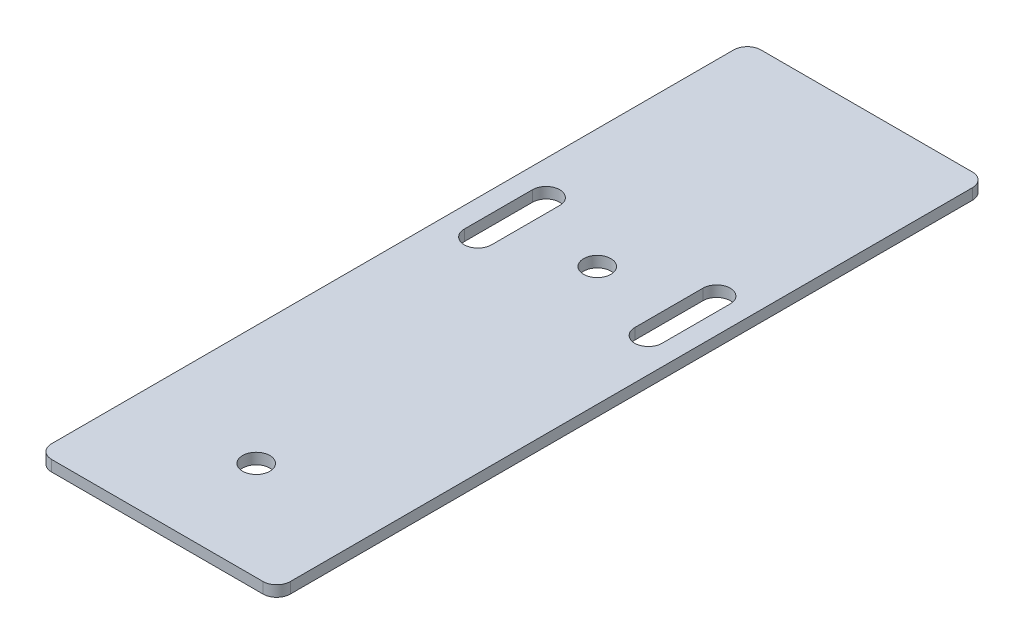
ISO-10303-21;
HEADER;
FILE_DESCRIPTION(('STEP AP214'),'2;1');
FILE_NAME('part.step','',(''),(''),'','','');
FILE_SCHEMA(('AUTOMOTIVE_DESIGN { 1 0 10303 214 1 1 1 1 }'));
ENDSEC;
DATA;
#1=APPLICATION_CONTEXT('core data for automotive mechanical design processes');
#2=APPLICATION_PROTOCOL_DEFINITION('international standard','automotive_design',2000,#1);
#3=PRODUCT_CONTEXT('',#1,'mechanical');
#4=PRODUCT('Part','Part','',(#3));
#5=PRODUCT_RELATED_PRODUCT_CATEGORY('part','',(#4));
#6=PRODUCT_DEFINITION_FORMATION('','',#4);
#7=PRODUCT_DEFINITION_CONTEXT('part definition',#1,'design');
#8=PRODUCT_DEFINITION('design','',#6,#7);
#9=PRODUCT_DEFINITION_SHAPE('','',#8);
#10=(LENGTH_UNIT() NAMED_UNIT(*) SI_UNIT(.MILLI.,.METRE.));
#11=(NAMED_UNIT(*) PLANE_ANGLE_UNIT() SI_UNIT($,.RADIAN.));
#12=(NAMED_UNIT(*) SI_UNIT($,.STERADIAN.) SOLID_ANGLE_UNIT());
#13=UNCERTAINTY_MEASURE_WITH_UNIT(LENGTH_MEASURE(1.E-05),#10,'distance_accuracy_value','');
#14=(GEOMETRIC_REPRESENTATION_CONTEXT(3) GLOBAL_UNCERTAINTY_ASSIGNED_CONTEXT((#13)) GLOBAL_UNIT_ASSIGNED_CONTEXT((#10,
#11,#12)) REPRESENTATION_CONTEXT('',''));
#15=CARTESIAN_POINT('',(0.,0.,0.));
#16=DIRECTION('',(0.,0.,1.));
#17=DIRECTION('',(1.,0.,0.));
#18=AXIS2_PLACEMENT_3D('',#15,#16,#17);
#19=CARTESIAN_POINT('',(17.5,1.6,-52.));
#20=DIRECTION('',(-1.,0.,0.));
#21=DIRECTION('',(0.,0.,1.));
#22=AXIS2_PLACEMENT_3D('',#19,#20,#21);
#23=PLANE('',#22);
#24=DIRECTION('',(0.,0.,-1.));
#25=VECTOR('',#24,1.);
#26=CARTESIAN_POINT('',(17.5,0.,-52.));
#27=LINE('',#26,#25);
#28=CARTESIAN_POINT('',(17.5,0.,50.));
#29=VERTEX_POINT('',#28);
#30=CARTESIAN_POINT('',(17.5,0.,-50.));
#31=VERTEX_POINT('',#30);
#32=EDGE_CURVE('E256',#29,#31,#27,.T.);
#33=ORIENTED_EDGE('',*,*,#32,.T.);
#34=DIRECTION('',(0.,-1.,0.));
#35=VECTOR('',#34,1.);
#36=CARTESIAN_POINT('',(17.5,1.6,-50.));
#37=LINE('',#36,#35);
#38=CARTESIAN_POINT('',(17.5,1.6,-50.));
#39=VERTEX_POINT('',#38);
#40=EDGE_CURVE('E337',#31,#39,#37,.F.);
#41=ORIENTED_EDGE('',*,*,#40,.T.);
#42=DIRECTION('',(0.,0.,-1.));
#43=VECTOR('',#42,1.);
#44=CARTESIAN_POINT('',(17.5,1.6,-52.));
#45=LINE('',#44,#43);
#46=CARTESIAN_POINT('',(17.5,1.6,50.));
#47=VERTEX_POINT('',#46);
#48=EDGE_CURVE('E268',#47,#39,#45,.T.);
#49=ORIENTED_EDGE('',*,*,#48,.F.);
#50=DIRECTION('',(0.,-1.,0.));
#51=VECTOR('',#50,1.);
#52=CARTESIAN_POINT('',(17.5,1.6,50.));
#53=LINE('',#52,#51);
#54=EDGE_CURVE('E333',#47,#29,#53,.T.);
#55=ORIENTED_EDGE('',*,*,#54,.T.);
#56=EDGE_LOOP('',(#33,#41,#49,#55));
#57=FACE_BOUND('',#56,.T.);
#58=ADVANCED_FACE('F38',(#57),#23,.F.);
#59=CARTESIAN_POINT('',(-17.5,1.6,-52.));
#60=DIRECTION('',(0.,0.,1.));
#61=DIRECTION('',(1.,0.,0.));
#62=AXIS2_PLACEMENT_3D('',#59,#60,#61);
#63=PLANE('',#62);
#64=DIRECTION('',(-1.,0.,0.));
#65=VECTOR('',#64,1.);
#66=CARTESIAN_POINT('',(-17.5,0.,-52.));
#67=LINE('',#66,#65);
#68=CARTESIAN_POINT('',(15.5,0.,-52.));
#69=VERTEX_POINT('',#68);
#70=CARTESIAN_POINT('',(-15.5,0.,-52.));
#71=VERTEX_POINT('',#70);
#72=EDGE_CURVE('E287',#69,#71,#67,.T.);
#73=ORIENTED_EDGE('',*,*,#72,.T.);
#74=DIRECTION('',(0.,-1.,0.));
#75=VECTOR('',#74,1.);
#76=CARTESIAN_POINT('',(-15.5,1.6,-52.));
#77=LINE('',#76,#75);
#78=CARTESIAN_POINT('',(-15.5,1.6,-52.));
#79=VERTEX_POINT('',#78);
#80=EDGE_CURVE('E319',#71,#79,#77,.F.);
#81=ORIENTED_EDGE('',*,*,#80,.T.);
#82=DIRECTION('',(-1.,0.,0.));
#83=VECTOR('',#82,1.);
#84=CARTESIAN_POINT('',(-17.5,1.6,-52.));
#85=LINE('',#84,#83);
#86=CARTESIAN_POINT('',(15.5,1.6,-52.));
#87=VERTEX_POINT('',#86);
#88=EDGE_CURVE('E272',#87,#79,#85,.T.);
#89=ORIENTED_EDGE('',*,*,#88,.F.);
#90=DIRECTION('',(0.,-1.,0.));
#91=VECTOR('',#90,1.);
#92=CARTESIAN_POINT('',(15.5,1.6,-52.));
#93=LINE('',#92,#91);
#94=EDGE_CURVE('E315',#87,#69,#93,.T.);
#95=ORIENTED_EDGE('',*,*,#94,.T.);
#96=EDGE_LOOP('',(#73,#81,#89,#95));
#97=FACE_BOUND('',#96,.T.);
#98=ADVANCED_FACE('F363',(#97),#63,.F.);
#99=CARTESIAN_POINT('',(-17.5,1.6,-52.));
#100=DIRECTION('',(1.,0.,0.));
#101=DIRECTION('',(0.,0.,-1.));
#102=AXIS2_PLACEMENT_3D('',#99,#100,#101);
#103=PLANE('',#102);
#104=DIRECTION('',(0.,0.,1.));
#105=VECTOR('',#104,1.);
#106=CARTESIAN_POINT('',(-17.5,1.6,-52.));
#107=LINE('',#106,#105);
#108=CARTESIAN_POINT('',(-17.5,1.6,-50.));
#109=VERTEX_POINT('',#108);
#110=CARTESIAN_POINT('',(-17.5,1.6,50.));
#111=VERTEX_POINT('',#110);
#112=EDGE_CURVE('E277',#109,#111,#107,.T.);
#113=ORIENTED_EDGE('',*,*,#112,.F.);
#114=DIRECTION('',(0.,-1.,0.));
#115=VECTOR('',#114,1.);
#116=CARTESIAN_POINT('',(-17.5,1.6,-50.));
#117=LINE('',#116,#115);
#118=CARTESIAN_POINT('',(-17.5,0.,-50.));
#119=VERTEX_POINT('',#118);
#120=EDGE_CURVE('E299',#109,#119,#117,.T.);
#121=ORIENTED_EDGE('',*,*,#120,.T.);
#122=DIRECTION('',(0.,0.,1.));
#123=VECTOR('',#122,1.);
#124=CARTESIAN_POINT('',(-17.5,0.,-52.));
#125=LINE('',#124,#123);
#126=CARTESIAN_POINT('',(-17.5,0.,50.));
#127=VERTEX_POINT('',#126);
#128=EDGE_CURVE('E291',#119,#127,#125,.T.);
#129=ORIENTED_EDGE('',*,*,#128,.T.);
#130=DIRECTION('',(0.,-1.,0.));
#131=VECTOR('',#130,1.);
#132=CARTESIAN_POINT('',(-17.5,1.6,50.));
#133=LINE('',#132,#131);
#134=EDGE_CURVE('E283',#127,#111,#133,.F.);
#135=ORIENTED_EDGE('',*,*,#134,.T.);
#136=EDGE_LOOP('',(#113,#121,#129,#135));
#137=FACE_BOUND('',#136,.T.);
#138=ADVANCED_FACE('F371',(#137),#103,.F.);
#139=CARTESIAN_POINT('',(-17.5,1.6,52.));
#140=DIRECTION('',(0.,0.,-1.));
#141=DIRECTION('',(-1.,0.,0.));
#142=AXIS2_PLACEMENT_3D('',#139,#140,#141);
#143=PLANE('',#142);
#144=DIRECTION('',(1.,0.,0.));
#145=VECTOR('',#144,1.);
#146=CARTESIAN_POINT('',(-17.5,0.,52.));
#147=LINE('',#146,#145);
#148=CARTESIAN_POINT('',(-15.5,0.,52.));
#149=VERTEX_POINT('',#148);
#150=CARTESIAN_POINT('',(15.5,0.,52.));
#151=VERTEX_POINT('',#150);
#152=EDGE_CURVE('E273',#149,#151,#147,.T.);
#153=ORIENTED_EDGE('',*,*,#152,.T.);
#154=DIRECTION('',(0.,-1.,0.));
#155=VECTOR('',#154,1.);
#156=CARTESIAN_POINT('',(15.5,1.6,52.));
#157=LINE('',#156,#155);
#158=CARTESIAN_POINT('',(15.5,1.6,52.));
#159=VERTEX_POINT('',#158);
#160=EDGE_CURVE('E11',#151,#159,#157,.F.);
#161=ORIENTED_EDGE('',*,*,#160,.T.);
#162=DIRECTION('',(1.,0.,0.));
#163=VECTOR('',#162,1.);
#164=CARTESIAN_POINT('',(-17.5,1.6,52.));
#165=LINE('',#164,#163);
#166=CARTESIAN_POINT('',(-15.5,1.6,52.));
#167=VERTEX_POINT('',#166);
#168=EDGE_CURVE('E280',#167,#159,#165,.T.);
#169=ORIENTED_EDGE('',*,*,#168,.F.);
#170=DIRECTION('',(0.,-1.,0.));
#171=VECTOR('',#170,1.);
#172=CARTESIAN_POINT('',(-15.5,1.6,52.));
#173=LINE('',#172,#171);
#174=EDGE_CURVE('E47',#167,#149,#173,.T.);
#175=ORIENTED_EDGE('',*,*,#174,.T.);
#176=EDGE_LOOP('',(#153,#161,#169,#175));
#177=FACE_BOUND('',#176,.T.);
#178=ADVANCED_FACE('F343',(#177),#143,.F.);
#179=CARTESIAN_POINT('',(0.,1.6,0.));
#180=DIRECTION('',(0.,1.,0.));
#181=DIRECTION('',(0.,0.,1.));
#182=AXIS2_PLACEMENT_3D('',#179,#180,#181);
#183=PLANE('',#182);
#184=CARTESIAN_POINT('',(12.5,1.6,-7.49999999999995));
#185=DIRECTION('',(0.,1.,0.));
#186=DIRECTION('',(0.,0.,1.));
#187=AXIS2_PLACEMENT_3D('',#184,#185,#186);
#188=CIRCLE('',#187,2.);
#189=CARTESIAN_POINT('',(10.5,1.6,-7.49999999999995));
#190=VERTEX_POINT('',#189);
#191=CARTESIAN_POINT('',(14.5,1.6,-7.49999999999995));
#192=VERTEX_POINT('',#191);
#193=EDGE_CURVE('E159',#190,#192,#188,.T.);
#194=ORIENTED_EDGE('',*,*,#193,.F.);
#195=DIRECTION('',(0.,0.,1.));
#196=VECTOR('',#195,1.);
#197=CARTESIAN_POINT('',(10.5,1.6,-7.49999999999995));
#198=LINE('',#197,#196);
#199=CARTESIAN_POINT('',(10.5,1.6,-17.5));
#200=VERTEX_POINT('',#199);
#201=EDGE_CURVE('E180',#200,#190,#198,.T.);
#202=ORIENTED_EDGE('',*,*,#201,.F.);
#203=CARTESIAN_POINT('',(12.5,1.6,-17.5));
#204=DIRECTION('',(0.,1.,0.));
#205=DIRECTION('',(0.,0.,1.));
#206=AXIS2_PLACEMENT_3D('',#203,#204,#205);
#207=CIRCLE('',#206,2.);
#208=CARTESIAN_POINT('',(14.5,1.6,-17.5));
#209=VERTEX_POINT('',#208);
#210=EDGE_CURVE('E184',#209,#200,#207,.T.);
#211=ORIENTED_EDGE('',*,*,#210,.F.);
#212=DIRECTION('',(0.,0.,-1.));
#213=VECTOR('',#212,1.);
#214=CARTESIAN_POINT('',(14.5,1.6,-7.49999999999995));
#215=LINE('',#214,#213);
#216=EDGE_CURVE('E193',#192,#209,#215,.T.);
#217=ORIENTED_EDGE('',*,*,#216,.F.);
#218=EDGE_LOOP('',(#194,#202,#211,#217));
#219=FACE_BOUND('',#218,.T.);
#220=CARTESIAN_POINT('',(-12.5,1.6,-7.49999999999995));
#221=DIRECTION('',(0.,1.,0.));
#222=DIRECTION('',(0.,0.,-1.));
#223=AXIS2_PLACEMENT_3D('',#220,#221,#222);
#224=CIRCLE('',#223,2.);
#225=CARTESIAN_POINT('',(-14.5,1.6,-7.49999999999995));
#226=VERTEX_POINT('',#225);
#227=CARTESIAN_POINT('',(-10.5,1.6,-7.49999999999995));
#228=VERTEX_POINT('',#227);
#229=EDGE_CURVE('E227',#226,#228,#224,.T.);
#230=ORIENTED_EDGE('',*,*,#229,.F.);
#231=DIRECTION('',(0.,0.,1.));
#232=VECTOR('',#231,1.);
#233=CARTESIAN_POINT('',(-14.5,1.6,-7.49999999999995));
#234=LINE('',#233,#232);
#235=CARTESIAN_POINT('',(-14.5,1.6,-17.5));
#236=VERTEX_POINT('',#235);
#237=EDGE_CURVE('E214',#236,#226,#234,.T.);
#238=ORIENTED_EDGE('',*,*,#237,.F.);
#239=CARTESIAN_POINT('',(-12.5,1.6,-17.5));
#240=DIRECTION('',(0.,1.,0.));
#241=DIRECTION('',(0.,0.,-1.));
#242=AXIS2_PLACEMENT_3D('',#239,#240,#241);
#243=CIRCLE('',#242,2.);
#244=CARTESIAN_POINT('',(-10.5,1.6,-17.5));
#245=VERTEX_POINT('',#244);
#246=EDGE_CURVE('E234',#245,#236,#243,.T.);
#247=ORIENTED_EDGE('',*,*,#246,.F.);
#248=DIRECTION('',(0.,0.,-1.));
#249=VECTOR('',#248,1.);
#250=CARTESIAN_POINT('',(-10.5,1.6,-7.49999999999995));
#251=LINE('',#250,#249);
#252=EDGE_CURVE('E230',#228,#245,#251,.T.);
#253=ORIENTED_EDGE('',*,*,#252,.F.);
#254=EDGE_LOOP('',(#230,#238,#247,#253));
#255=FACE_BOUND('',#254,.T.);
#256=CARTESIAN_POINT('',(0.,1.6,-12.5));
#257=DIRECTION('',(0.,1.,0.));
#258=DIRECTION('',(0.,0.,1.));
#259=AXIS2_PLACEMENT_3D('',#256,#257,#258);
#260=CIRCLE('',#259,1.99999999999999);
#261=CARTESIAN_POINT('',(0.,1.6,-10.5));
#262=VERTEX_POINT('',#261);
#263=EDGE_CURVE('E257',#262,#262,#260,.T.);
#264=ORIENTED_EDGE('',*,*,#263,.F.);
#265=EDGE_LOOP('',(#264));
#266=FACE_BOUND('',#265,.T.);
#267=CARTESIAN_POINT('',(0.,1.6,37.5));
#268=DIRECTION('',(0.,1.,0.));
#269=DIRECTION('',(0.,0.,1.));
#270=AXIS2_PLACEMENT_3D('',#267,#268,#269);
#271=CIRCLE('',#270,2.00000000000001);
#272=CARTESIAN_POINT('',(0.,1.6,39.5));
#273=VERTEX_POINT('',#272);
#274=EDGE_CURVE('E203',#273,#273,#271,.T.);
#275=ORIENTED_EDGE('',*,*,#274,.F.);
#276=EDGE_LOOP('',(#275));
#277=FACE_BOUND('',#276,.T.);
#278=ORIENTED_EDGE('',*,*,#88,.T.);
#279=CARTESIAN_POINT('',(-15.5,1.6,-50.));
#280=DIRECTION('',(0.,1.,0.));
#281=DIRECTION('',(0.,0.,1.));
#282=AXIS2_PLACEMENT_3D('',#279,#280,#281);
#283=CIRCLE('',#282,2.);
#284=EDGE_CURVE('E330',#79,#109,#283,.T.);
#285=ORIENTED_EDGE('',*,*,#284,.T.);
#286=ORIENTED_EDGE('',*,*,#112,.T.);
#287=CARTESIAN_POINT('',(-15.5,1.6,50.));
#288=DIRECTION('',(0.,1.,0.));
#289=DIRECTION('',(0.,0.,1.));
#290=AXIS2_PLACEMENT_3D('',#287,#288,#289);
#291=CIRCLE('',#290,2.);
#292=EDGE_CURVE('E59',#111,#167,#291,.T.);
#293=ORIENTED_EDGE('',*,*,#292,.T.);
#294=ORIENTED_EDGE('',*,*,#168,.T.);
#295=CARTESIAN_POINT('',(15.5,1.6,50.));
#296=DIRECTION('',(0.,1.,0.));
#297=DIRECTION('',(0.,0.,1.));
#298=AXIS2_PLACEMENT_3D('',#295,#296,#297);
#299=CIRCLE('',#298,2.);
#300=EDGE_CURVE('E324',#159,#47,#299,.T.);
#301=ORIENTED_EDGE('',*,*,#300,.T.);
#302=ORIENTED_EDGE('',*,*,#48,.T.);
#303=CARTESIAN_POINT('',(15.5,1.6,-50.));
#304=DIRECTION('',(0.,1.,0.));
#305=DIRECTION('',(0.,0.,1.));
#306=AXIS2_PLACEMENT_3D('',#303,#304,#305);
#307=CIRCLE('',#306,2.);
#308=EDGE_CURVE('E327',#39,#87,#307,.T.);
#309=ORIENTED_EDGE('',*,*,#308,.T.);
#310=EDGE_LOOP('',(#278,#285,#286,#293,#294,#301,#302,#309));
#311=FACE_BOUND('',#310,.T.);
#312=ADVANCED_FACE('F356',(#219,#255,#266,#277,#311),#183,.T.);
#313=CARTESIAN_POINT('',(0.,0.,0.));
#314=DIRECTION('',(0.,1.,0.));
#315=DIRECTION('',(0.,0.,1.));
#316=AXIS2_PLACEMENT_3D('',#313,#314,#315);
#317=PLANE('',#316);
#318=DIRECTION('',(0.,0.,1.));
#319=VECTOR('',#318,1.);
#320=CARTESIAN_POINT('',(10.5,0.,-7.49999999999995));
#321=LINE('',#320,#319);
#322=CARTESIAN_POINT('',(10.5,0.,-17.5));
#323=VERTEX_POINT('',#322);
#324=CARTESIAN_POINT('',(10.5,0.,-7.49999999999995));
#325=VERTEX_POINT('',#324);
#326=EDGE_CURVE('E165',#323,#325,#321,.T.);
#327=ORIENTED_EDGE('',*,*,#326,.T.);
#328=CARTESIAN_POINT('',(12.5,0.,-7.49999999999995));
#329=DIRECTION('',(0.,1.,0.));
#330=DIRECTION('',(0.,0.,1.));
#331=AXIS2_PLACEMENT_3D('',#328,#329,#330);
#332=CIRCLE('',#331,2.);
#333=CARTESIAN_POINT('',(14.5,0.,-7.49999999999995));
#334=VERTEX_POINT('',#333);
#335=EDGE_CURVE('E156',#325,#334,#332,.T.);
#336=ORIENTED_EDGE('',*,*,#335,.T.);
#337=DIRECTION('',(0.,0.,-1.));
#338=VECTOR('',#337,1.);
#339=CARTESIAN_POINT('',(14.5,0.,-7.49999999999995));
#340=LINE('',#339,#338);
#341=CARTESIAN_POINT('',(14.5,0.,-17.5));
#342=VERTEX_POINT('',#341);
#343=EDGE_CURVE('E169',#334,#342,#340,.T.);
#344=ORIENTED_EDGE('',*,*,#343,.T.);
#345=CARTESIAN_POINT('',(12.5,0.,-17.5));
#346=DIRECTION('',(0.,1.,0.));
#347=DIRECTION('',(0.,0.,1.));
#348=AXIS2_PLACEMENT_3D('',#345,#346,#347);
#349=CIRCLE('',#348,2.);
#350=EDGE_CURVE('E174',#342,#323,#349,.T.);
#351=ORIENTED_EDGE('',*,*,#350,.T.);
#352=EDGE_LOOP('',(#327,#336,#344,#351));
#353=FACE_BOUND('',#352,.T.);
#354=DIRECTION('',(0.,0.,1.));
#355=VECTOR('',#354,1.);
#356=CARTESIAN_POINT('',(-14.5,0.,-7.49999999999995));
#357=LINE('',#356,#355);
#358=CARTESIAN_POINT('',(-14.5,0.,-17.5));
#359=VERTEX_POINT('',#358);
#360=CARTESIAN_POINT('',(-14.5,0.,-7.49999999999995));
#361=VERTEX_POINT('',#360);
#362=EDGE_CURVE('E222',#359,#361,#357,.T.);
#363=ORIENTED_EDGE('',*,*,#362,.T.);
#364=CARTESIAN_POINT('',(-12.5,0.,-7.49999999999995));
#365=DIRECTION('',(0.,1.,0.));
#366=DIRECTION('',(0.,0.,-1.));
#367=AXIS2_PLACEMENT_3D('',#364,#365,#366);
#368=CIRCLE('',#367,2.);
#369=CARTESIAN_POINT('',(-10.5,0.,-7.49999999999995));
#370=VERTEX_POINT('',#369);
#371=EDGE_CURVE('E209',#361,#370,#368,.T.);
#372=ORIENTED_EDGE('',*,*,#371,.T.);
#373=DIRECTION('',(0.,0.,-1.));
#374=VECTOR('',#373,1.);
#375=CARTESIAN_POINT('',(-10.5,0.,-7.49999999999995));
#376=LINE('',#375,#374);
#377=CARTESIAN_POINT('',(-10.5,0.,-17.5));
#378=VERTEX_POINT('',#377);
#379=EDGE_CURVE('E213',#370,#378,#376,.T.);
#380=ORIENTED_EDGE('',*,*,#379,.T.);
#381=CARTESIAN_POINT('',(-12.5,0.,-17.5));
#382=DIRECTION('',(0.,1.,0.));
#383=DIRECTION('',(0.,0.,-1.));
#384=AXIS2_PLACEMENT_3D('',#381,#382,#383);
#385=CIRCLE('',#384,2.);
#386=EDGE_CURVE('E218',#378,#359,#385,.T.);
#387=ORIENTED_EDGE('',*,*,#386,.T.);
#388=EDGE_LOOP('',(#363,#372,#380,#387));
#389=FACE_BOUND('',#388,.T.);
#390=CARTESIAN_POINT('',(0.,0.,-12.5));
#391=DIRECTION('',(0.,1.,0.));
#392=DIRECTION('',(0.,0.,1.));
#393=AXIS2_PLACEMENT_3D('',#390,#391,#392);
#394=CIRCLE('',#393,1.99999999999999);
#395=CARTESIAN_POINT('',(0.,0.,-10.5));
#396=VERTEX_POINT('',#395);
#397=EDGE_CURVE('E252',#396,#396,#394,.T.);
#398=ORIENTED_EDGE('',*,*,#397,.T.);
#399=EDGE_LOOP('',(#398));
#400=FACE_BOUND('',#399,.T.);
#401=CARTESIAN_POINT('',(0.,0.,37.5));
#402=DIRECTION('',(0.,1.,0.));
#403=DIRECTION('',(0.,0.,1.));
#404=AXIS2_PLACEMENT_3D('',#401,#402,#403);
#405=CIRCLE('',#404,2.00000000000001);
#406=CARTESIAN_POINT('',(0.,0.,39.5));
#407=VERTEX_POINT('',#406);
#408=EDGE_CURVE('E261',#407,#407,#405,.T.);
#409=ORIENTED_EDGE('',*,*,#408,.T.);
#410=EDGE_LOOP('',(#409));
#411=FACE_BOUND('',#410,.T.);
#412=ORIENTED_EDGE('',*,*,#128,.F.);
#413=CARTESIAN_POINT('',(-15.5,0.,-50.));
#414=DIRECTION('',(0.,1.,0.));
#415=DIRECTION('',(0.,0.,1.));
#416=AXIS2_PLACEMENT_3D('',#413,#414,#415);
#417=CIRCLE('',#416,2.);
#418=EDGE_CURVE('E312',#119,#71,#417,.F.);
#419=ORIENTED_EDGE('',*,*,#418,.T.);
#420=ORIENTED_EDGE('',*,*,#72,.F.);
#421=CARTESIAN_POINT('',(15.5,0.,-50.));
#422=DIRECTION('',(0.,1.,0.));
#423=DIRECTION('',(0.,0.,1.));
#424=AXIS2_PLACEMENT_3D('',#421,#422,#423);
#425=CIRCLE('',#424,2.);
#426=EDGE_CURVE('E309',#69,#31,#425,.F.);
#427=ORIENTED_EDGE('',*,*,#426,.T.);
#428=ORIENTED_EDGE('',*,*,#32,.F.);
#429=CARTESIAN_POINT('',(15.5,0.,50.));
#430=DIRECTION('',(0.,1.,0.));
#431=DIRECTION('',(0.,0.,1.));
#432=AXIS2_PLACEMENT_3D('',#429,#430,#431);
#433=CIRCLE('',#432,2.);
#434=EDGE_CURVE('E306',#29,#151,#433,.F.);
#435=ORIENTED_EDGE('',*,*,#434,.T.);
#436=ORIENTED_EDGE('',*,*,#152,.F.);
#437=CARTESIAN_POINT('',(-15.5,0.,50.));
#438=DIRECTION('',(0.,1.,0.));
#439=DIRECTION('',(0.,0.,1.));
#440=AXIS2_PLACEMENT_3D('',#437,#438,#439);
#441=CIRCLE('',#440,2.);
#442=EDGE_CURVE('E303',#149,#127,#441,.F.);
#443=ORIENTED_EDGE('',*,*,#442,.T.);
#444=EDGE_LOOP('',(#412,#419,#420,#427,#428,#435,#436,#443));
#445=FACE_BOUND('',#444,.T.);
#446=ADVANCED_FACE('F176',(#353,#389,#400,#411,#445),#317,.F.);
#447=CARTESIAN_POINT('',(0.,0.,37.5));
#448=DIRECTION('',(0.,1.,0.));
#449=DIRECTION('',(0.,0.,1.));
#450=AXIS2_PLACEMENT_3D('',#447,#448,#449);
#451=CYLINDRICAL_SURFACE('',#450,2.00000000000001);
#452=ORIENTED_EDGE('',*,*,#408,.F.);
#453=EDGE_LOOP('',(#452));
#454=FACE_BOUND('',#453,.T.);
#455=ORIENTED_EDGE('',*,*,#274,.T.);
#456=EDGE_LOOP('',(#455));
#457=FACE_BOUND('',#456,.T.);
#458=ADVANCED_FACE('F486',(#454,#457),#451,.F.);
#459=CARTESIAN_POINT('',(0.,0.,-12.5));
#460=DIRECTION('',(0.,1.,0.));
#461=DIRECTION('',(0.,0.,1.));
#462=AXIS2_PLACEMENT_3D('',#459,#460,#461);
#463=CYLINDRICAL_SURFACE('',#462,1.99999999999999);
#464=ORIENTED_EDGE('',*,*,#397,.F.);
#465=EDGE_LOOP('',(#464));
#466=FACE_BOUND('',#465,.T.);
#467=ORIENTED_EDGE('',*,*,#263,.T.);
#468=EDGE_LOOP('',(#467));
#469=FACE_BOUND('',#468,.T.);
#470=ADVANCED_FACE('F477',(#466,#469),#463,.F.);
#471=CARTESIAN_POINT('',(-12.5,0.,-7.49999999999995));
#472=DIRECTION('',(0.,1.,0.));
#473=DIRECTION('',(0.,0.,1.));
#474=AXIS2_PLACEMENT_3D('',#471,#472,#473);
#475=CYLINDRICAL_SURFACE('',#474,2.);
#476=ORIENTED_EDGE('',*,*,#229,.T.);
#477=DIRECTION('',(0.,1.,0.));
#478=VECTOR('',#477,1.);
#479=CARTESIAN_POINT('',(-10.5,0.,-7.49999999999995));
#480=LINE('',#479,#478);
#481=EDGE_CURVE('E226',#370,#228,#480,.T.);
#482=ORIENTED_EDGE('',*,*,#481,.F.);
#483=ORIENTED_EDGE('',*,*,#371,.F.);
#484=DIRECTION('',(0.,1.,0.));
#485=VECTOR('',#484,1.);
#486=CARTESIAN_POINT('',(-14.5,0.,-7.49999999999995));
#487=LINE('',#486,#485);
#488=EDGE_CURVE('E194',#361,#226,#487,.T.);
#489=ORIENTED_EDGE('',*,*,#488,.T.);
#490=EDGE_LOOP('',(#476,#482,#483,#489));
#491=FACE_BOUND('',#490,.T.);
#492=ADVANCED_FACE('F468',(#491),#475,.F.);
#493=CARTESIAN_POINT('',(-14.5,0.,-7.49999999999995));
#494=DIRECTION('',(-1.,0.,0.));
#495=DIRECTION('',(0.,0.,1.));
#496=AXIS2_PLACEMENT_3D('',#493,#494,#495);
#497=PLANE('',#496);
#498=ORIENTED_EDGE('',*,*,#237,.T.);
#499=ORIENTED_EDGE('',*,*,#488,.F.);
#500=ORIENTED_EDGE('',*,*,#362,.F.);
#501=DIRECTION('',(0.,1.,0.));
#502=VECTOR('',#501,1.);
#503=CARTESIAN_POINT('',(-14.5,0.,-17.5));
#504=LINE('',#503,#502);
#505=EDGE_CURVE('E243',#359,#236,#504,.T.);
#506=ORIENTED_EDGE('',*,*,#505,.T.);
#507=EDGE_LOOP('',(#498,#499,#500,#506));
#508=FACE_BOUND('',#507,.T.);
#509=ADVANCED_FACE('F459',(#508),#497,.F.);
#510=CARTESIAN_POINT('',(-12.5,0.,-17.5));
#511=DIRECTION('',(0.,1.,0.));
#512=DIRECTION('',(0.,0.,1.));
#513=AXIS2_PLACEMENT_3D('',#510,#511,#512);
#514=CYLINDRICAL_SURFACE('',#513,2.);
#515=ORIENTED_EDGE('',*,*,#246,.T.);
#516=ORIENTED_EDGE('',*,*,#505,.F.);
#517=ORIENTED_EDGE('',*,*,#386,.F.);
#518=DIRECTION('',(0.,1.,0.));
#519=VECTOR('',#518,1.);
#520=CARTESIAN_POINT('',(-10.5,0.,-17.5));
#521=LINE('',#520,#519);
#522=EDGE_CURVE('E246',#378,#245,#521,.T.);
#523=ORIENTED_EDGE('',*,*,#522,.T.);
#524=EDGE_LOOP('',(#515,#516,#517,#523));
#525=FACE_BOUND('',#524,.T.);
#526=ADVANCED_FACE('F450',(#525),#514,.F.);
#527=CARTESIAN_POINT('',(-10.5,0.,-7.49999999999995));
#528=DIRECTION('',(1.,0.,0.));
#529=DIRECTION('',(0.,0.,-1.));
#530=AXIS2_PLACEMENT_3D('',#527,#528,#529);
#531=PLANE('',#530);
#532=ORIENTED_EDGE('',*,*,#252,.T.);
#533=ORIENTED_EDGE('',*,*,#522,.F.);
#534=ORIENTED_EDGE('',*,*,#379,.F.);
#535=ORIENTED_EDGE('',*,*,#481,.T.);
#536=EDGE_LOOP('',(#532,#533,#534,#535));
#537=FACE_BOUND('',#536,.T.);
#538=ADVANCED_FACE('F442',(#537),#531,.F.);
#539=CARTESIAN_POINT('',(12.5,0.,-7.49999999999995));
#540=DIRECTION('',(0.,1.,0.));
#541=DIRECTION('',(0.,0.,1.));
#542=AXIS2_PLACEMENT_3D('',#539,#540,#541);
#543=CYLINDRICAL_SURFACE('',#542,2.);
#544=ORIENTED_EDGE('',*,*,#193,.T.);
#545=DIRECTION('',(0.,1.,0.));
#546=VECTOR('',#545,1.);
#547=CARTESIAN_POINT('',(14.5,0.,-7.49999999999995));
#548=LINE('',#547,#546);
#549=EDGE_CURVE('E152',#334,#192,#548,.T.);
#550=ORIENTED_EDGE('',*,*,#549,.F.);
#551=ORIENTED_EDGE('',*,*,#335,.F.);
#552=DIRECTION('',(0.,1.,0.));
#553=VECTOR('',#552,1.);
#554=CARTESIAN_POINT('',(10.5,0.,-7.49999999999995));
#555=LINE('',#554,#553);
#556=EDGE_CURVE('E200',#325,#190,#555,.T.);
#557=ORIENTED_EDGE('',*,*,#556,.T.);
#558=EDGE_LOOP('',(#544,#550,#551,#557));
#559=FACE_BOUND('',#558,.T.);
#560=ADVANCED_FACE('F154',(#559),#543,.F.);
#561=CARTESIAN_POINT('',(10.5,0.,-7.49999999999995));
#562=DIRECTION('',(-1.,0.,0.));
#563=DIRECTION('',(0.,0.,1.));
#564=AXIS2_PLACEMENT_3D('',#561,#562,#563);
#565=PLANE('',#564);
#566=ORIENTED_EDGE('',*,*,#201,.T.);
#567=ORIENTED_EDGE('',*,*,#556,.F.);
#568=ORIENTED_EDGE('',*,*,#326,.F.);
#569=DIRECTION('',(0.,1.,0.));
#570=VECTOR('',#569,1.);
#571=CARTESIAN_POINT('',(10.5,0.,-17.5));
#572=LINE('',#571,#570);
#573=EDGE_CURVE('E204',#323,#200,#572,.T.);
#574=ORIENTED_EDGE('',*,*,#573,.T.);
#575=EDGE_LOOP('',(#566,#567,#568,#574));
#576=FACE_BOUND('',#575,.T.);
#577=ADVANCED_FACE('F425',(#576),#565,.F.);
#578=CARTESIAN_POINT('',(12.5,0.,-17.5));
#579=DIRECTION('',(0.,1.,0.));
#580=DIRECTION('',(0.,0.,1.));
#581=AXIS2_PLACEMENT_3D('',#578,#579,#580);
#582=CYLINDRICAL_SURFACE('',#581,2.);
#583=ORIENTED_EDGE('',*,*,#210,.T.);
#584=ORIENTED_EDGE('',*,*,#573,.F.);
#585=ORIENTED_EDGE('',*,*,#350,.F.);
#586=DIRECTION('',(0.,1.,0.));
#587=VECTOR('',#586,1.);
#588=CARTESIAN_POINT('',(14.5,0.,-17.5));
#589=LINE('',#588,#587);
#590=EDGE_CURVE('E164',#342,#209,#589,.T.);
#591=ORIENTED_EDGE('',*,*,#590,.T.);
#592=EDGE_LOOP('',(#583,#584,#585,#591));
#593=FACE_BOUND('',#592,.T.);
#594=ADVANCED_FACE('F417',(#593),#582,.F.);
#595=CARTESIAN_POINT('',(14.5,0.,-7.49999999999995));
#596=DIRECTION('',(1.,0.,0.));
#597=DIRECTION('',(0.,0.,-1.));
#598=AXIS2_PLACEMENT_3D('',#595,#596,#597);
#599=PLANE('',#598);
#600=ORIENTED_EDGE('',*,*,#216,.T.);
#601=ORIENTED_EDGE('',*,*,#590,.F.);
#602=ORIENTED_EDGE('',*,*,#343,.F.);
#603=ORIENTED_EDGE('',*,*,#549,.T.);
#604=EDGE_LOOP('',(#600,#601,#602,#603));
#605=FACE_BOUND('',#604,.T.);
#606=ADVANCED_FACE('F170',(#605),#599,.F.);
#607=CARTESIAN_POINT('',(-15.5,1.6,-50.));
#608=DIRECTION('',(0.,-1.,0.));
#609=DIRECTION('',(0.,0.,-1.));
#610=AXIS2_PLACEMENT_3D('',#607,#608,#609);
#611=CYLINDRICAL_SURFACE('',#610,2.);
#612=ORIENTED_EDGE('',*,*,#284,.F.);
#613=ORIENTED_EDGE('',*,*,#80,.F.);
#614=ORIENTED_EDGE('',*,*,#418,.F.);
#615=ORIENTED_EDGE('',*,*,#120,.F.);
#616=EDGE_LOOP('',(#612,#613,#614,#615));
#617=FACE_BOUND('',#616,.T.);
#618=ADVANCED_FACE('F368',(#617),#611,.T.);
#619=CARTESIAN_POINT('',(15.5,1.6,-50.));
#620=DIRECTION('',(0.,-1.,0.));
#621=DIRECTION('',(0.,0.,-1.));
#622=AXIS2_PLACEMENT_3D('',#619,#620,#621);
#623=CYLINDRICAL_SURFACE('',#622,2.);
#624=ORIENTED_EDGE('',*,*,#308,.F.);
#625=ORIENTED_EDGE('',*,*,#40,.F.);
#626=ORIENTED_EDGE('',*,*,#426,.F.);
#627=ORIENTED_EDGE('',*,*,#94,.F.);
#628=EDGE_LOOP('',(#624,#625,#626,#627));
#629=FACE_BOUND('',#628,.T.);
#630=ADVANCED_FACE('F360',(#629),#623,.T.);
#631=CARTESIAN_POINT('',(15.5,1.6,50.));
#632=DIRECTION('',(0.,-1.,0.));
#633=DIRECTION('',(0.,0.,-1.));
#634=AXIS2_PLACEMENT_3D('',#631,#632,#633);
#635=CYLINDRICAL_SURFACE('',#634,2.);
#636=ORIENTED_EDGE('',*,*,#300,.F.);
#637=ORIENTED_EDGE('',*,*,#160,.F.);
#638=ORIENTED_EDGE('',*,*,#434,.F.);
#639=ORIENTED_EDGE('',*,*,#54,.F.);
#640=EDGE_LOOP('',(#636,#637,#638,#639));
#641=FACE_BOUND('',#640,.T.);
#642=ADVANCED_FACE('F351',(#641),#635,.T.);
#643=CARTESIAN_POINT('',(-15.5,1.6,50.));
#644=DIRECTION('',(0.,-1.,0.));
#645=DIRECTION('',(0.,0.,-1.));
#646=AXIS2_PLACEMENT_3D('',#643,#644,#645);
#647=CYLINDRICAL_SURFACE('',#646,2.);
#648=ORIENTED_EDGE('',*,*,#292,.F.);
#649=ORIENTED_EDGE('',*,*,#134,.F.);
#650=ORIENTED_EDGE('',*,*,#442,.F.);
#651=ORIENTED_EDGE('',*,*,#174,.F.);
#652=EDGE_LOOP('',(#648,#649,#650,#651));
#653=FACE_BOUND('',#652,.T.);
#654=ADVANCED_FACE('F40',(#653),#647,.T.);
#655=CLOSED_SHELL('',(#58,#98,#138,#178,#312,#446,#458,#470,#492,#509,#526,#538,#560,#577,#594,
#606,#618,#630,#642,#654));
#656=MANIFOLD_SOLID_BREP('B2',#655);
#657=ADVANCED_BREP_SHAPE_REPRESENTATION('',(#18,#656),#14);
#658=SHAPE_DEFINITION_REPRESENTATION(#9,#657);
ENDSEC;
END-ISO-10303-21;
